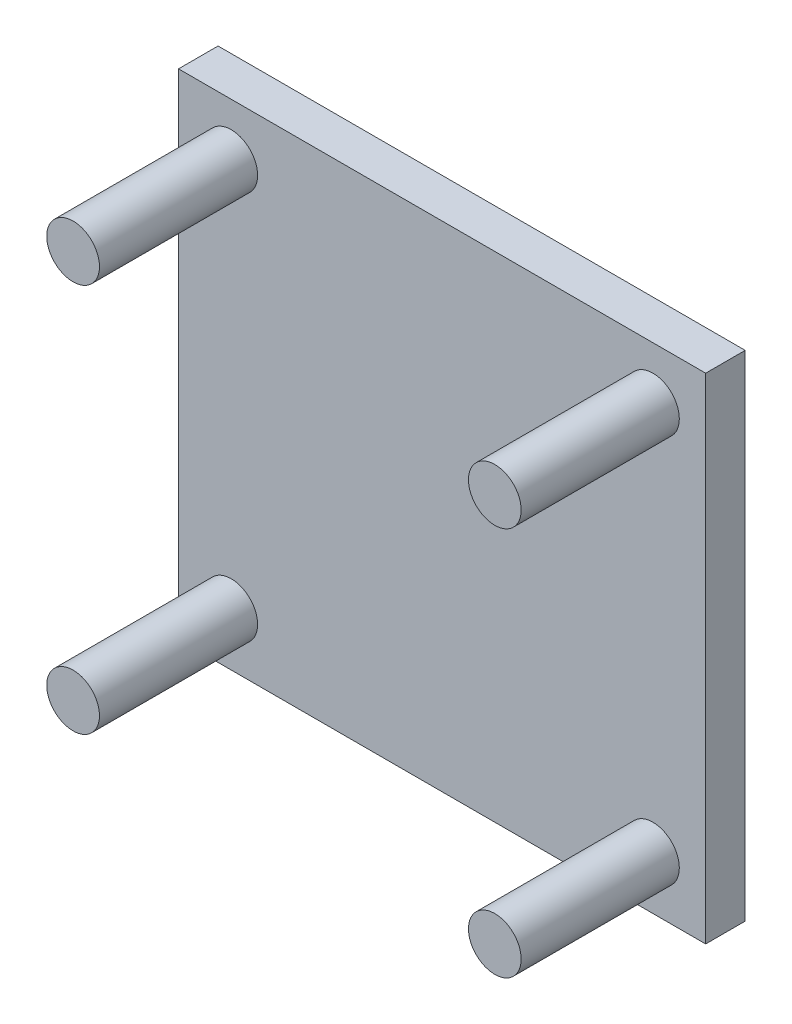
ISO-10303-21;
HEADER;
FILE_DESCRIPTION(('STEP AP214'),'2;1');
FILE_NAME('part.step','',(''),(''),'','','');
FILE_SCHEMA(('AUTOMOTIVE_DESIGN { 1 0 10303 214 1 1 1 1 }'));
ENDSEC;
DATA;
#1=APPLICATION_CONTEXT('core data for automotive mechanical design processes');
#2=APPLICATION_PROTOCOL_DEFINITION('international standard','automotive_design',2000,#1);
#3=PRODUCT_CONTEXT('',#1,'mechanical');
#4=PRODUCT('Part','Part','',(#3));
#5=PRODUCT_RELATED_PRODUCT_CATEGORY('part','',(#4));
#6=PRODUCT_DEFINITION_FORMATION('','',#4);
#7=PRODUCT_DEFINITION_CONTEXT('part definition',#1,'design');
#8=PRODUCT_DEFINITION('design','',#6,#7);
#9=PRODUCT_DEFINITION_SHAPE('','',#8);
#10=(LENGTH_UNIT() NAMED_UNIT(*) SI_UNIT(.MILLI.,.METRE.));
#11=(NAMED_UNIT(*) PLANE_ANGLE_UNIT() SI_UNIT($,.RADIAN.));
#12=(NAMED_UNIT(*) SI_UNIT($,.STERADIAN.) SOLID_ANGLE_UNIT());
#13=UNCERTAINTY_MEASURE_WITH_UNIT(LENGTH_MEASURE(1.E-05),#10,'distance_accuracy_value','');
#14=(GEOMETRIC_REPRESENTATION_CONTEXT(3) GLOBAL_UNCERTAINTY_ASSIGNED_CONTEXT((#13)) GLOBAL_UNIT_ASSIGNED_CONTEXT((#10,
#11,#12)) REPRESENTATION_CONTEXT('',''));
#15=CARTESIAN_POINT('',(0.,0.,0.));
#16=DIRECTION('',(0.,0.,1.));
#17=DIRECTION('',(1.,0.,0.));
#18=AXIS2_PLACEMENT_3D('',#15,#16,#17);
#19=CARTESIAN_POINT('',(-20.,18.7553077630509,3.));
#20=DIRECTION('',(1.,0.,0.));
#21=DIRECTION('',(0.,0.,-1.));
#22=AXIS2_PLACEMENT_3D('',#19,#20,#21);
#23=PLANE('',#22);
#24=DIRECTION('',(0.,-1.,0.));
#25=VECTOR('',#24,1.);
#26=CARTESIAN_POINT('',(-20.,18.7553077630509,0.));
#27=LINE('',#26,#25);
#28=CARTESIAN_POINT('',(-20.,18.7553077630509,0.));
#29=VERTEX_POINT('',#28);
#30=CARTESIAN_POINT('',(-20.,-18.7553077630509,0.));
#31=VERTEX_POINT('',#30);
#32=EDGE_CURVE('E100',#29,#31,#27,.T.);
#33=ORIENTED_EDGE('',*,*,#32,.T.);
#34=DIRECTION('',(0.,0.,-1.));
#35=VECTOR('',#34,1.);
#36=CARTESIAN_POINT('',(-20.,-18.7553077630509,3.));
#37=LINE('',#36,#35);
#38=CARTESIAN_POINT('',(-20.,-18.7553077630509,3.));
#39=VERTEX_POINT('',#38);
#40=EDGE_CURVE('E11',#39,#31,#37,.T.);
#41=ORIENTED_EDGE('',*,*,#40,.F.);
#42=DIRECTION('',(0.,-1.,0.));
#43=VECTOR('',#42,1.);
#44=CARTESIAN_POINT('',(-20.,18.7553077630509,3.));
#45=LINE('',#44,#43);
#46=CARTESIAN_POINT('',(-20.,18.7553077630509,3.));
#47=VERTEX_POINT('',#46);
#48=EDGE_CURVE('E88',#47,#39,#45,.T.);
#49=ORIENTED_EDGE('',*,*,#48,.F.);
#50=DIRECTION('',(0.,0.,-1.));
#51=VECTOR('',#50,1.);
#52=CARTESIAN_POINT('',(-20.,18.7553077630509,3.));
#53=LINE('',#52,#51);
#54=EDGE_CURVE('E96',#47,#29,#53,.T.);
#55=ORIENTED_EDGE('',*,*,#54,.T.);
#56=EDGE_LOOP('',(#33,#41,#49,#55));
#57=FACE_BOUND('',#56,.T.);
#58=ADVANCED_FACE('F37',(#57),#23,.F.);
#59=CARTESIAN_POINT('',(-20.,-18.7553077630509,3.));
#60=DIRECTION('',(0.,1.,0.));
#61=DIRECTION('',(0.,0.,1.));
#62=AXIS2_PLACEMENT_3D('',#59,#60,#61);
#63=PLANE('',#62);
#64=DIRECTION('',(1.,0.,0.));
#65=VECTOR('',#64,1.);
#66=CARTESIAN_POINT('',(-20.,-18.7553077630509,0.));
#67=LINE('',#66,#65);
#68=CARTESIAN_POINT('',(20.,-18.7553077630509,0.));
#69=VERTEX_POINT('',#68);
#70=EDGE_CURVE('E92',#31,#69,#67,.T.);
#71=ORIENTED_EDGE('',*,*,#70,.T.);
#72=DIRECTION('',(0.,0.,-1.));
#73=VECTOR('',#72,1.);
#74=CARTESIAN_POINT('',(20.,-18.7553077630509,3.));
#75=LINE('',#74,#73);
#76=CARTESIAN_POINT('',(20.,-18.7553077630509,3.));
#77=VERTEX_POINT('',#76);
#78=EDGE_CURVE('E45',#77,#69,#75,.T.);
#79=ORIENTED_EDGE('',*,*,#78,.F.);
#80=DIRECTION('',(1.,0.,0.));
#81=VECTOR('',#80,1.);
#82=CARTESIAN_POINT('',(-20.,-18.7553077630509,3.));
#83=LINE('',#82,#81);
#84=EDGE_CURVE('E83',#39,#77,#83,.T.);
#85=ORIENTED_EDGE('',*,*,#84,.F.);
#86=ORIENTED_EDGE('',*,*,#40,.T.);
#87=EDGE_LOOP('',(#71,#79,#85,#86));
#88=FACE_BOUND('',#87,.T.);
#89=ADVANCED_FACE('F91',(#88),#63,.F.);
#90=CARTESIAN_POINT('',(20.,-18.7553077630509,3.));
#91=DIRECTION('',(-1.,0.,0.));
#92=DIRECTION('',(0.,0.,1.));
#93=AXIS2_PLACEMENT_3D('',#90,#91,#92);
#94=PLANE('',#93);
#95=DIRECTION('',(0.,1.,0.));
#96=VECTOR('',#95,1.);
#97=CARTESIAN_POINT('',(20.,-18.7553077630509,0.));
#98=LINE('',#97,#96);
#99=CARTESIAN_POINT('',(20.,18.7553077630509,0.));
#100=VERTEX_POINT('',#99);
#101=EDGE_CURVE('E70',#69,#100,#98,.T.);
#102=ORIENTED_EDGE('',*,*,#101,.T.);
#103=DIRECTION('',(0.,0.,-1.));
#104=VECTOR('',#103,1.);
#105=CARTESIAN_POINT('',(20.,18.7553077630509,3.));
#106=LINE('',#105,#104);
#107=CARTESIAN_POINT('',(20.,18.7553077630509,3.));
#108=VERTEX_POINT('',#107);
#109=EDGE_CURVE('E93',#108,#100,#106,.T.);
#110=ORIENTED_EDGE('',*,*,#109,.F.);
#111=DIRECTION('',(0.,1.,0.));
#112=VECTOR('',#111,1.);
#113=CARTESIAN_POINT('',(20.,-18.7553077630509,3.));
#114=LINE('',#113,#112);
#115=EDGE_CURVE('E86',#77,#108,#114,.T.);
#116=ORIENTED_EDGE('',*,*,#115,.F.);
#117=ORIENTED_EDGE('',*,*,#78,.T.);
#118=EDGE_LOOP('',(#102,#110,#116,#117));
#119=FACE_BOUND('',#118,.T.);
#120=ADVANCED_FACE('F94',(#119),#94,.F.);
#121=CARTESIAN_POINT('',(20.,18.7553077630509,3.));
#122=DIRECTION('',(0.,-1.,0.));
#123=DIRECTION('',(0.,0.,-1.));
#124=AXIS2_PLACEMENT_3D('',#121,#122,#123);
#125=PLANE('',#124);
#126=DIRECTION('',(-1.,0.,0.));
#127=VECTOR('',#126,1.);
#128=CARTESIAN_POINT('',(20.,18.7553077630509,0.));
#129=LINE('',#128,#127);
#130=EDGE_CURVE('E76',#100,#29,#129,.T.);
#131=ORIENTED_EDGE('',*,*,#130,.T.);
#132=ORIENTED_EDGE('',*,*,#54,.F.);
#133=DIRECTION('',(-1.,0.,0.));
#134=VECTOR('',#133,1.);
#135=CARTESIAN_POINT('',(20.,18.7553077630509,3.));
#136=LINE('',#135,#134);
#137=EDGE_CURVE('E53',#108,#47,#136,.T.);
#138=ORIENTED_EDGE('',*,*,#137,.F.);
#139=ORIENTED_EDGE('',*,*,#109,.T.);
#140=EDGE_LOOP('',(#131,#132,#138,#139));
#141=FACE_BOUND('',#140,.T.);
#142=ADVANCED_FACE('F108',(#141),#125,.F.);
#143=CARTESIAN_POINT('',(0.,0.,3.));
#144=DIRECTION('',(0.,0.,1.));
#145=DIRECTION('',(1.,0.,0.));
#146=AXIS2_PLACEMENT_3D('',#143,#144,#145);
#147=PLANE('',#146);
#148=CARTESIAN_POINT('',(16.,14.7553077630509,3.));
#149=DIRECTION('',(0.,0.,1.));
#150=DIRECTION('',(1.,0.,0.));
#151=AXIS2_PLACEMENT_3D('',#148,#149,#150);
#152=CIRCLE('',#151,2.);
#153=CARTESIAN_POINT('',(18.,14.7553077630509,3.));
#154=VERTEX_POINT('',#153);
#155=EDGE_CURVE('E132',#154,#154,#152,.T.);
#156=ORIENTED_EDGE('',*,*,#155,.F.);
#157=EDGE_LOOP('',(#156));
#158=FACE_BOUND('',#157,.T.);
#159=CARTESIAN_POINT('',(16.,-14.7553077630509,3.));
#160=DIRECTION('',(0.,0.,1.));
#161=DIRECTION('',(1.,0.,0.));
#162=AXIS2_PLACEMENT_3D('',#159,#160,#161);
#163=CIRCLE('',#162,2.);
#164=CARTESIAN_POINT('',(18.,-14.7553077630509,3.));
#165=VERTEX_POINT('',#164);
#166=EDGE_CURVE('E126',#165,#165,#163,.T.);
#167=ORIENTED_EDGE('',*,*,#166,.F.);
#168=EDGE_LOOP('',(#167));
#169=FACE_BOUND('',#168,.T.);
#170=CARTESIAN_POINT('',(-16.,14.7553077630509,3.));
#171=DIRECTION('',(0.,0.,1.));
#172=DIRECTION('',(1.,0.,0.));
#173=AXIS2_PLACEMENT_3D('',#170,#171,#172);
#174=CIRCLE('',#173,2.);
#175=CARTESIAN_POINT('',(-14.,14.7553077630509,3.));
#176=VERTEX_POINT('',#175);
#177=EDGE_CURVE('E120',#176,#176,#174,.T.);
#178=ORIENTED_EDGE('',*,*,#177,.F.);
#179=EDGE_LOOP('',(#178));
#180=FACE_BOUND('',#179,.T.);
#181=CARTESIAN_POINT('',(-16.,-14.7553077630509,3.));
#182=DIRECTION('',(0.,0.,1.));
#183=DIRECTION('',(1.,0.,0.));
#184=AXIS2_PLACEMENT_3D('',#181,#182,#183);
#185=CIRCLE('',#184,2.);
#186=CARTESIAN_POINT('',(-14.,-14.7553077630509,3.));
#187=VERTEX_POINT('',#186);
#188=EDGE_CURVE('E114',#187,#187,#185,.T.);
#189=ORIENTED_EDGE('',*,*,#188,.F.);
#190=EDGE_LOOP('',(#189));
#191=FACE_BOUND('',#190,.T.);
#192=ORIENTED_EDGE('',*,*,#48,.T.);
#193=ORIENTED_EDGE('',*,*,#84,.T.);
#194=ORIENTED_EDGE('',*,*,#115,.T.);
#195=ORIENTED_EDGE('',*,*,#137,.T.);
#196=EDGE_LOOP('',(#192,#193,#194,#195));
#197=FACE_BOUND('',#196,.T.);
#198=ADVANCED_FACE('F84',(#158,#169,#180,#191,#197),#147,.T.);
#199=CARTESIAN_POINT('',(0.,0.,0.));
#200=DIRECTION('',(0.,0.,1.));
#201=DIRECTION('',(1.,0.,0.));
#202=AXIS2_PLACEMENT_3D('',#199,#200,#201);
#203=PLANE('',#202);
#204=ORIENTED_EDGE('',*,*,#32,.F.);
#205=ORIENTED_EDGE('',*,*,#130,.F.);
#206=ORIENTED_EDGE('',*,*,#101,.F.);
#207=ORIENTED_EDGE('',*,*,#70,.F.);
#208=EDGE_LOOP('',(#204,#205,#206,#207));
#209=FACE_BOUND('',#208,.T.);
#210=ADVANCED_FACE('F111',(#209),#203,.F.);
#211=CARTESIAN_POINT('',(-16.,-14.7553077630509,15.));
#212=DIRECTION('',(0.,0.,-1.));
#213=DIRECTION('',(-1.,0.,0.));
#214=AXIS2_PLACEMENT_3D('',#211,#212,#213);
#215=CYLINDRICAL_SURFACE('',#214,2.);
#216=CARTESIAN_POINT('',(-16.,-14.7553077630509,15.));
#217=DIRECTION('',(0.,0.,1.));
#218=DIRECTION('',(1.,0.,0.));
#219=AXIS2_PLACEMENT_3D('',#216,#217,#218);
#220=CIRCLE('',#219,2.);
#221=CARTESIAN_POINT('',(-14.,-14.7553077630509,15.));
#222=VERTEX_POINT('',#221);
#223=EDGE_CURVE('E103',#222,#222,#220,.T.);
#224=ORIENTED_EDGE('',*,*,#223,.F.);
#225=EDGE_LOOP('',(#224));
#226=FACE_BOUND('',#225,.T.);
#227=ORIENTED_EDGE('',*,*,#188,.T.);
#228=EDGE_LOOP('',(#227));
#229=FACE_BOUND('',#228,.T.);
#230=ADVANCED_FACE('F156',(#226,#229),#215,.T.);
#231=CARTESIAN_POINT('',(-16.,-14.7553077630509,15.));
#232=DIRECTION('',(0.,0.,1.));
#233=DIRECTION('',(1.,0.,0.));
#234=AXIS2_PLACEMENT_3D('',#231,#232,#233);
#235=PLANE('',#234);
#236=ORIENTED_EDGE('',*,*,#223,.T.);
#237=EDGE_LOOP('',(#236));
#238=FACE_BOUND('',#237,.T.);
#239=ADVANCED_FACE('F158',(#238),#235,.T.);
#240=CARTESIAN_POINT('',(-16.,14.7553077630509,15.));
#241=DIRECTION('',(0.,0.,-1.));
#242=DIRECTION('',(-1.,0.,0.));
#243=AXIS2_PLACEMENT_3D('',#240,#241,#242);
#244=CYLINDRICAL_SURFACE('',#243,2.);
#245=CARTESIAN_POINT('',(-16.,14.7553077630509,15.));
#246=DIRECTION('',(0.,0.,1.));
#247=DIRECTION('',(1.,0.,0.));
#248=AXIS2_PLACEMENT_3D('',#245,#246,#247);
#249=CIRCLE('',#248,2.);
#250=CARTESIAN_POINT('',(-14.,14.7553077630509,15.));
#251=VERTEX_POINT('',#250);
#252=EDGE_CURVE('E117',#251,#251,#249,.T.);
#253=ORIENTED_EDGE('',*,*,#252,.F.);
#254=EDGE_LOOP('',(#253));
#255=FACE_BOUND('',#254,.T.);
#256=ORIENTED_EDGE('',*,*,#177,.T.);
#257=EDGE_LOOP('',(#256));
#258=FACE_BOUND('',#257,.T.);
#259=ADVANCED_FACE('F165',(#255,#258),#244,.T.);
#260=CARTESIAN_POINT('',(-16.,14.7553077630509,15.));
#261=DIRECTION('',(0.,0.,1.));
#262=DIRECTION('',(1.,0.,0.));
#263=AXIS2_PLACEMENT_3D('',#260,#261,#262);
#264=PLANE('',#263);
#265=ORIENTED_EDGE('',*,*,#252,.T.);
#266=EDGE_LOOP('',(#265));
#267=FACE_BOUND('',#266,.T.);
#268=ADVANCED_FACE('F213',(#267),#264,.T.);
#269=CARTESIAN_POINT('',(16.,-14.7553077630509,15.));
#270=DIRECTION('',(0.,0.,-1.));
#271=DIRECTION('',(-1.,0.,0.));
#272=AXIS2_PLACEMENT_3D('',#269,#270,#271);
#273=CYLINDRICAL_SURFACE('',#272,2.);
#274=CARTESIAN_POINT('',(16.,-14.7553077630509,15.));
#275=DIRECTION('',(0.,0.,1.));
#276=DIRECTION('',(1.,0.,0.));
#277=AXIS2_PLACEMENT_3D('',#274,#275,#276);
#278=CIRCLE('',#277,2.);
#279=CARTESIAN_POINT('',(18.,-14.7553077630509,15.));
#280=VERTEX_POINT('',#279);
#281=EDGE_CURVE('E123',#280,#280,#278,.T.);
#282=ORIENTED_EDGE('',*,*,#281,.F.);
#283=EDGE_LOOP('',(#282));
#284=FACE_BOUND('',#283,.T.);
#285=ORIENTED_EDGE('',*,*,#166,.T.);
#286=EDGE_LOOP('',(#285));
#287=FACE_BOUND('',#286,.T.);
#288=ADVANCED_FACE('F222',(#284,#287),#273,.T.);
#289=CARTESIAN_POINT('',(16.,-14.7553077630509,15.));
#290=DIRECTION('',(0.,0.,1.));
#291=DIRECTION('',(1.,0.,0.));
#292=AXIS2_PLACEMENT_3D('',#289,#290,#291);
#293=PLANE('',#292);
#294=ORIENTED_EDGE('',*,*,#281,.T.);
#295=EDGE_LOOP('',(#294));
#296=FACE_BOUND('',#295,.T.);
#297=ADVANCED_FACE('F143',(#296),#293,.T.);
#298=CARTESIAN_POINT('',(16.,14.7553077630509,15.));
#299=DIRECTION('',(0.,0.,-1.));
#300=DIRECTION('',(-1.,0.,0.));
#301=AXIS2_PLACEMENT_3D('',#298,#299,#300);
#302=CYLINDRICAL_SURFACE('',#301,2.);
#303=CARTESIAN_POINT('',(16.,14.7553077630509,15.));
#304=DIRECTION('',(0.,0.,1.));
#305=DIRECTION('',(1.,0.,0.));
#306=AXIS2_PLACEMENT_3D('',#303,#304,#305);
#307=CIRCLE('',#306,2.);
#308=CARTESIAN_POINT('',(18.,14.7553077630509,15.));
#309=VERTEX_POINT('',#308);
#310=EDGE_CURVE('E129',#309,#309,#307,.T.);
#311=ORIENTED_EDGE('',*,*,#310,.F.);
#312=EDGE_LOOP('',(#311));
#313=FACE_BOUND('',#312,.T.);
#314=ORIENTED_EDGE('',*,*,#155,.T.);
#315=EDGE_LOOP('',(#314));
#316=FACE_BOUND('',#315,.T.);
#317=ADVANCED_FACE('F140',(#313,#316),#302,.T.);
#318=CARTESIAN_POINT('',(16.,14.7553077630509,15.));
#319=DIRECTION('',(0.,0.,1.));
#320=DIRECTION('',(1.,0.,0.));
#321=AXIS2_PLACEMENT_3D('',#318,#319,#320);
#322=PLANE('',#321);
#323=ORIENTED_EDGE('',*,*,#310,.T.);
#324=EDGE_LOOP('',(#323));
#325=FACE_BOUND('',#324,.T.);
#326=ADVANCED_FACE('F138',(#325),#322,.T.);
#327=CLOSED_SHELL('',(#58,#89,#120,#142,#198,#210,#230,#239,#259,#268,#288,#297,#317,#326));
#328=MANIFOLD_SOLID_BREP('B2',#327);
#329=ADVANCED_BREP_SHAPE_REPRESENTATION('',(#18,#328),#14);
#330=SHAPE_DEFINITION_REPRESENTATION(#9,#329);
ENDSEC;
END-ISO-10303-21;
